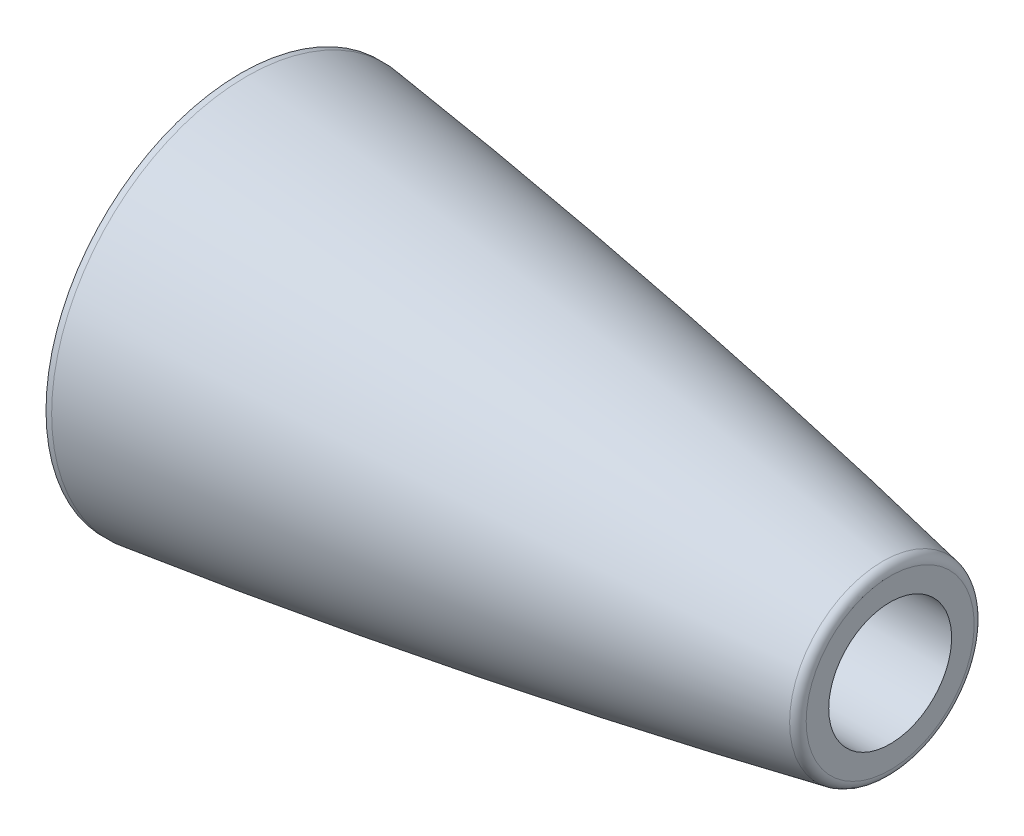
ISO-10303-21;
HEADER;
FILE_DESCRIPTION(('STEP AP214'),'2;1');
FILE_NAME('part.step','',(''),(''),'','','');
FILE_SCHEMA(('AUTOMOTIVE_DESIGN { 1 0 10303 214 1 1 1 1 }'));
ENDSEC;
DATA;
#1=APPLICATION_CONTEXT('core data for automotive mechanical design processes');
#2=APPLICATION_PROTOCOL_DEFINITION('international standard','automotive_design',2000,#1);
#3=PRODUCT_CONTEXT('',#1,'mechanical');
#4=PRODUCT('Part','Part','',(#3));
#5=PRODUCT_RELATED_PRODUCT_CATEGORY('part','',(#4));
#6=PRODUCT_DEFINITION_FORMATION('','',#4);
#7=PRODUCT_DEFINITION_CONTEXT('part definition',#1,'design');
#8=PRODUCT_DEFINITION('design','',#6,#7);
#9=PRODUCT_DEFINITION_SHAPE('','',#8);
#10=(LENGTH_UNIT() NAMED_UNIT(*) SI_UNIT(.MILLI.,.METRE.));
#11=(NAMED_UNIT(*) PLANE_ANGLE_UNIT() SI_UNIT($,.RADIAN.));
#12=(NAMED_UNIT(*) SI_UNIT($,.STERADIAN.) SOLID_ANGLE_UNIT());
#13=UNCERTAINTY_MEASURE_WITH_UNIT(LENGTH_MEASURE(1.E-05),#10,'distance_accuracy_value','');
#14=(GEOMETRIC_REPRESENTATION_CONTEXT(3) GLOBAL_UNCERTAINTY_ASSIGNED_CONTEXT((#13)) GLOBAL_UNIT_ASSIGNED_CONTEXT((#10,
#11,#12)) REPRESENTATION_CONTEXT('',''));
#15=CARTESIAN_POINT('',(0.,0.,0.));
#16=DIRECTION('',(0.,0.,1.));
#17=DIRECTION('',(1.,0.,0.));
#18=AXIS2_PLACEMENT_3D('',#15,#16,#17);
#19=CARTESIAN_POINT('',(-22.8767001186629,0.,0.));
#20=DIRECTION('',(-1.,0.,0.));
#21=DIRECTION('',(0.,0.,1.));
#22=AXIS2_PLACEMENT_3D('',#19,#20,#21);
#23=DEGENERATE_TOROIDAL_SURFACE('',#22,183.647952257666,189.250551958227,.F.);
#24=CARTESIAN_POINT('',(0.121522619087668,0.,0.));
#25=DIRECTION('',(-1.,0.,0.));
#26=DIRECTION('',(0.,0.,1.));
#27=AXIS2_PLACEMENT_3D('',#24,#25,#26);
#28=CIRCLE('',#27,4.2);
#29=CARTESIAN_POINT('',(0.121522619087668,0.,4.2));
#30=VERTEX_POINT('',#29);
#31=EDGE_CURVE('E63',#30,#30,#28,.T.);
#32=ORIENTED_EDGE('',*,*,#31,.F.);
#33=EDGE_LOOP('',(#32));
#34=FACE_BOUND('',#33,.T.);
#35=CARTESIAN_POINT('',(13.8388009447619,0.,0.));
#36=DIRECTION('',(-1.,0.,0.));
#37=DIRECTION('',(0.,0.,1.));
#38=AXIS2_PLACEMENT_3D('',#35,#36,#37);
#39=CIRCLE('',#38,2.006951793251);
#40=CARTESIAN_POINT('',(13.8388009447619,0.,2.006951793251));
#41=VERTEX_POINT('',#40);
#42=EDGE_CURVE('E10',#41,#41,#39,.T.);
#43=ORIENTED_EDGE('',*,*,#42,.T.);
#44=EDGE_LOOP('',(#43));
#45=FACE_BOUND('',#44,.T.);
#46=ADVANCED_FACE('F32',(#34,#45),#23,.F.);
#47=CARTESIAN_POINT('',(13.8,0.,0.));
#48=DIRECTION('',(-1.,0.,0.));
#49=DIRECTION('',(0.,0.,1.));
#50=AXIS2_PLACEMENT_3D('',#47,#48,#49);
#51=TOROIDAL_SURFACE('',#50,1.81075167427655,0.200000000000004);
#52=ORIENTED_EDGE('',*,*,#42,.F.);
#53=EDGE_LOOP('',(#52));
#54=FACE_BOUND('',#53,.T.);
#55=CARTESIAN_POINT('',(14.,0.,0.));
#56=DIRECTION('',(-1.,0.,0.));
#57=DIRECTION('',(0.,0.,1.));
#58=AXIS2_PLACEMENT_3D('',#55,#56,#57);
#59=CIRCLE('',#58,1.81075167427655);
#60=CARTESIAN_POINT('',(14.,0.,1.81075167427655));
#61=VERTEX_POINT('',#60);
#62=EDGE_CURVE('E38',#61,#61,#59,.T.);
#63=ORIENTED_EDGE('',*,*,#62,.T.);
#64=EDGE_LOOP('',(#63));
#65=FACE_BOUND('',#64,.T.);
#66=ADVANCED_FACE('F70',(#54,#65),#51,.T.);
#67=CARTESIAN_POINT('',(14.,1.81075167427655,0.));
#68=DIRECTION('',(-1.,0.,0.));
#69=DIRECTION('',(0.,0.,1.));
#70=AXIS2_PLACEMENT_3D('',#67,#68,#69);
#71=PLANE('',#70);
#72=ORIENTED_EDGE('',*,*,#62,.F.);
#73=EDGE_LOOP('',(#72));
#74=FACE_BOUND('',#73,.T.);
#75=CARTESIAN_POINT('',(14.,0.,0.));
#76=DIRECTION('',(-1.,0.,0.));
#77=DIRECTION('',(0.,0.,1.));
#78=AXIS2_PLACEMENT_3D('',#75,#76,#77);
#79=CIRCLE('',#78,1.325);
#80=CARTESIAN_POINT('',(14.,0.,1.325));
#81=VERTEX_POINT('',#80);
#82=EDGE_CURVE('E42',#81,#81,#79,.T.);
#83=ORIENTED_EDGE('',*,*,#82,.T.);
#84=EDGE_LOOP('',(#83));
#85=FACE_BOUND('',#84,.T.);
#86=ADVANCED_FACE('F74',(#74,#85),#71,.F.);
#87=CARTESIAN_POINT('',(0.,0.,0.));
#88=DIRECTION('',(-1.,0.,0.));
#89=DIRECTION('',(0.,0.,1.));
#90=AXIS2_PLACEMENT_3D('',#87,#88,#89);
#91=CYLINDRICAL_SURFACE('',#90,1.325);
#92=ORIENTED_EDGE('',*,*,#82,.F.);
#93=EDGE_LOOP('',(#92));
#94=FACE_BOUND('',#93,.T.);
#95=CARTESIAN_POINT('',(10.25,0.,0.));
#96=DIRECTION('',(-1.,0.,0.));
#97=DIRECTION('',(0.,0.,1.));
#98=AXIS2_PLACEMENT_3D('',#95,#96,#97);
#99=CIRCLE('',#98,1.325);
#100=CARTESIAN_POINT('',(10.25,0.,1.325));
#101=VERTEX_POINT('',#100);
#102=EDGE_CURVE('E46',#101,#101,#99,.T.);
#103=ORIENTED_EDGE('',*,*,#102,.T.);
#104=EDGE_LOOP('',(#103));
#105=FACE_BOUND('',#104,.T.);
#106=ADVANCED_FACE('F79',(#94,#105),#91,.F.);
#107=CARTESIAN_POINT('',(10.25,1.66500479559912,0.));
#108=DIRECTION('',(1.,0.,0.));
#109=DIRECTION('',(0.,0.,-1.));
#110=AXIS2_PLACEMENT_3D('',#107,#108,#109);
#111=PLANE('',#110);
#112=ORIENTED_EDGE('',*,*,#102,.F.);
#113=EDGE_LOOP('',(#112));
#114=FACE_BOUND('',#113,.T.);
#115=CARTESIAN_POINT('',(10.25,0.,0.));
#116=DIRECTION('',(-1.,0.,0.));
#117=DIRECTION('',(0.,0.,1.));
#118=AXIS2_PLACEMENT_3D('',#115,#116,#117);
#119=CIRCLE('',#118,1.66500479559912);
#120=CARTESIAN_POINT('',(10.25,0.,1.66500479559912));
#121=VERTEX_POINT('',#120);
#122=EDGE_CURVE('E51',#121,#121,#119,.T.);
#123=ORIENTED_EDGE('',*,*,#122,.T.);
#124=EDGE_LOOP('',(#123));
#125=FACE_BOUND('',#124,.T.);
#126=ADVANCED_FACE('F85',(#114,#125),#111,.F.);
#127=CARTESIAN_POINT('',(3.76708993996353,0.,0.));
#128=DIRECTION('',(-1.,0.,0.));
#129=DIRECTION('',(0.,0.,1.));
#130=AXIS2_PLACEMENT_3D('',#127,#128,#129);
#131=CONICAL_SURFACE('',#130,3.001987912891,0.20338056538883);
#132=ORIENTED_EDGE('',*,*,#122,.F.);
#133=EDGE_LOOP('',(#132));
#134=FACE_BOUND('',#133,.T.);
#135=CARTESIAN_POINT('',(3.76708993996353,0.,0.));
#136=DIRECTION('',(-1.,0.,0.));
#137=DIRECTION('',(0.,0.,1.));
#138=AXIS2_PLACEMENT_3D('',#135,#136,#137);
#139=CIRCLE('',#138,3.001987912891);
#140=CARTESIAN_POINT('',(3.76708993996353,0.,3.001987912891));
#141=VERTEX_POINT('',#140);
#142=EDGE_CURVE('E54',#141,#141,#139,.T.);
#143=ORIENTED_EDGE('',*,*,#142,.T.);
#144=EDGE_LOOP('',(#143));
#145=FACE_BOUND('',#144,.T.);
#146=ADVANCED_FACE('F89',(#134,#145),#131,.F.);
#147=CARTESIAN_POINT('',(0.,0.,0.));
#148=DIRECTION('',(-1.,0.,0.));
#149=DIRECTION('',(0.,0.,1.));
#150=AXIS2_PLACEMENT_3D('',#147,#148,#149);
#151=CONICAL_SURFACE('',#150,3.20741133743627,0.0544771088841201);
#152=ORIENTED_EDGE('',*,*,#142,.F.);
#153=EDGE_LOOP('',(#152));
#154=FACE_BOUND('',#153,.T.);
#155=CARTESIAN_POINT('',(0.,0.,0.));
#156=DIRECTION('',(-1.,0.,0.));
#157=DIRECTION('',(0.,0.,1.));
#158=AXIS2_PLACEMENT_3D('',#155,#156,#157);
#159=CIRCLE('',#158,3.20741133743627);
#160=CARTESIAN_POINT('',(0.,0.,3.20741133743627));
#161=VERTEX_POINT('',#160);
#162=EDGE_CURVE('E57',#161,#161,#159,.T.);
#163=ORIENTED_EDGE('',*,*,#162,.T.);
#164=EDGE_LOOP('',(#163));
#165=FACE_BOUND('',#164,.T.);
#166=ADVANCED_FACE('F93',(#154,#165),#151,.F.);
#167=CARTESIAN_POINT('',(0.,3.20741133743627,0.));
#168=DIRECTION('',(1.,0.,0.));
#169=DIRECTION('',(0.,0.,-1.));
#170=AXIS2_PLACEMENT_3D('',#167,#168,#169);
#171=PLANE('',#170);
#172=ORIENTED_EDGE('',*,*,#162,.F.);
#173=EDGE_LOOP('',(#172));
#174=FACE_BOUND('',#173,.T.);
#175=CARTESIAN_POINT('',(0.,0.,0.));
#176=DIRECTION('',(-1.,0.,0.));
#177=DIRECTION('',(0.,0.,1.));
#178=AXIS2_PLACEMENT_3D('',#175,#176,#177);
#179=CIRCLE('',#178,4.2);
#180=CARTESIAN_POINT('',(0.,0.,4.2));
#181=VERTEX_POINT('',#180);
#182=EDGE_CURVE('E60',#181,#181,#179,.T.);
#183=ORIENTED_EDGE('',*,*,#182,.T.);
#184=EDGE_LOOP('',(#183));
#185=FACE_BOUND('',#184,.T.);
#186=ADVANCED_FACE('F97',(#174,#185),#171,.F.);
#187=CARTESIAN_POINT('',(0.,0.,0.));
#188=DIRECTION('',(-1.,0.,0.));
#189=DIRECTION('',(0.,0.,1.));
#190=AXIS2_PLACEMENT_3D('',#187,#188,#189);
#191=CYLINDRICAL_SURFACE('',#190,4.2);
#192=ORIENTED_EDGE('',*,*,#182,.F.);
#193=EDGE_LOOP('',(#192));
#194=FACE_BOUND('',#193,.T.);
#195=ORIENTED_EDGE('',*,*,#31,.T.);
#196=EDGE_LOOP('',(#195));
#197=FACE_BOUND('',#196,.T.);
#198=ADVANCED_FACE('F67',(#194,#197),#191,.T.);
#199=CLOSED_SHELL('',(#46,#66,#86,#106,#126,#146,#166,#186,#198));
#200=MANIFOLD_SOLID_BREP('B2',#199);
#201=ADVANCED_BREP_SHAPE_REPRESENTATION('',(#18,#200),#14);
#202=SHAPE_DEFINITION_REPRESENTATION(#9,#201);
ENDSEC;
END-ISO-10303-21;
